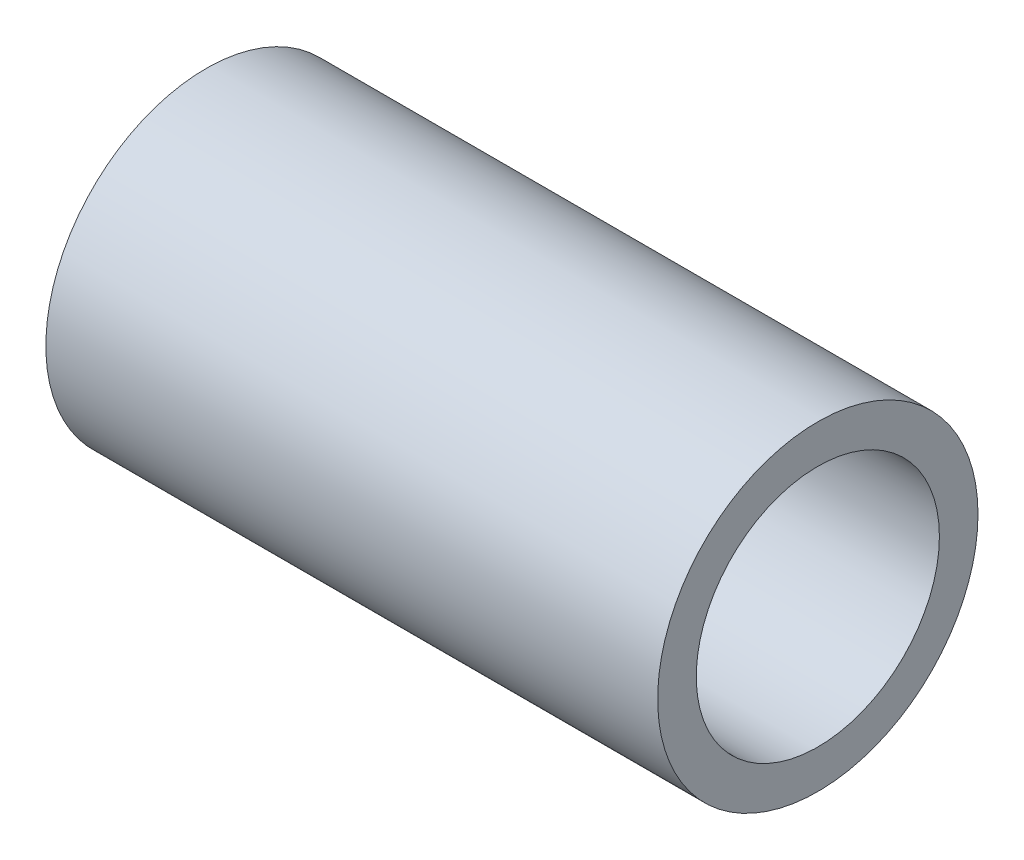
ISO-10303-21;
HEADER;
FILE_DESCRIPTION(('STEP AP214'),'2;1');
FILE_NAME('part.step','',(''),(''),'','','');
FILE_SCHEMA(('AUTOMOTIVE_DESIGN { 1 0 10303 214 1 1 1 1 }'));
ENDSEC;
DATA;
#1=APPLICATION_CONTEXT('core data for automotive mechanical design processes');
#2=APPLICATION_PROTOCOL_DEFINITION('international standard','automotive_design',2000,#1);
#3=PRODUCT_CONTEXT('',#1,'mechanical');
#4=PRODUCT('Part','Part','',(#3));
#5=PRODUCT_RELATED_PRODUCT_CATEGORY('part','',(#4));
#6=PRODUCT_DEFINITION_FORMATION('','',#4);
#7=PRODUCT_DEFINITION_CONTEXT('part definition',#1,'design');
#8=PRODUCT_DEFINITION('design','',#6,#7);
#9=PRODUCT_DEFINITION_SHAPE('','',#8);
#10=(LENGTH_UNIT() NAMED_UNIT(*) SI_UNIT(.MILLI.,.METRE.));
#11=(NAMED_UNIT(*) PLANE_ANGLE_UNIT() SI_UNIT($,.RADIAN.));
#12=(NAMED_UNIT(*) SI_UNIT($,.STERADIAN.) SOLID_ANGLE_UNIT());
#13=UNCERTAINTY_MEASURE_WITH_UNIT(LENGTH_MEASURE(1.E-05),#10,'distance_accuracy_value','');
#14=(GEOMETRIC_REPRESENTATION_CONTEXT(3) GLOBAL_UNCERTAINTY_ASSIGNED_CONTEXT((#13)) GLOBAL_UNIT_ASSIGNED_CONTEXT((#10,
#11,#12)) REPRESENTATION_CONTEXT('',''));
#15=CARTESIAN_POINT('',(0.,0.,0.));
#16=DIRECTION('',(0.,0.,1.));
#17=DIRECTION('',(1.,0.,0.));
#18=AXIS2_PLACEMENT_3D('',#15,#16,#17);
#19=CARTESIAN_POINT('',(50.325,0.,0.));
#20=DIRECTION('',(1.,0.,0.));
#21=DIRECTION('',(0.,0.,-1.));
#22=AXIS2_PLACEMENT_3D('',#19,#20,#21);
#23=PLANE('',#22);
#24=CARTESIAN_POINT('',(50.325,0.,0.));
#25=DIRECTION('',(1.,0.,0.));
#26=DIRECTION('',(0.,0.,-1.));
#27=AXIS2_PLACEMENT_3D('',#24,#25,#26);
#28=CIRCLE('',#27,13.175);
#29=CARTESIAN_POINT('',(50.325,0.,-13.175));
#30=VERTEX_POINT('',#29);
#31=EDGE_CURVE('E10',#30,#30,#28,.T.);
#32=ORIENTED_EDGE('',*,*,#31,.T.);
#33=EDGE_LOOP('',(#32));
#34=FACE_BOUND('',#33,.T.);
#35=CARTESIAN_POINT('',(50.325,0.,0.));
#36=DIRECTION('',(1.,0.,0.));
#37=DIRECTION('',(0.,0.,-1.));
#38=AXIS2_PLACEMENT_3D('',#35,#36,#37);
#39=CIRCLE('',#38,10.);
#40=CARTESIAN_POINT('',(50.325,0.,-10.));
#41=VERTEX_POINT('',#40);
#42=EDGE_CURVE('E40',#41,#41,#39,.T.);
#43=ORIENTED_EDGE('',*,*,#42,.F.);
#44=EDGE_LOOP('',(#43));
#45=FACE_BOUND('',#44,.T.);
#46=ADVANCED_FACE('F29',(#34,#45),#23,.T.);
#47=CARTESIAN_POINT('',(0.,0.,0.));
#48=DIRECTION('',(1.,0.,0.));
#49=DIRECTION('',(0.,0.,-1.));
#50=AXIS2_PLACEMENT_3D('',#47,#48,#49);
#51=PLANE('',#50);
#52=CARTESIAN_POINT('',(0.,0.,0.));
#53=DIRECTION('',(1.,0.,0.));
#54=DIRECTION('',(0.,0.,-1.));
#55=AXIS2_PLACEMENT_3D('',#52,#53,#54);
#56=CIRCLE('',#55,13.175);
#57=CARTESIAN_POINT('',(0.,0.,-13.175));
#58=VERTEX_POINT('',#57);
#59=EDGE_CURVE('E33',#58,#58,#56,.T.);
#60=ORIENTED_EDGE('',*,*,#59,.F.);
#61=EDGE_LOOP('',(#60));
#62=FACE_BOUND('',#61,.T.);
#63=CARTESIAN_POINT('',(0.,0.,0.));
#64=DIRECTION('',(1.,0.,0.));
#65=DIRECTION('',(0.,0.,-1.));
#66=AXIS2_PLACEMENT_3D('',#63,#64,#65);
#67=CIRCLE('',#66,10.);
#68=CARTESIAN_POINT('',(0.,0.,-10.));
#69=VERTEX_POINT('',#68);
#70=EDGE_CURVE('E42',#69,#69,#67,.T.);
#71=ORIENTED_EDGE('',*,*,#70,.T.);
#72=EDGE_LOOP('',(#71));
#73=FACE_BOUND('',#72,.T.);
#74=ADVANCED_FACE('F52',(#62,#73),#51,.F.);
#75=CARTESIAN_POINT('',(50.325,0.,0.));
#76=DIRECTION('',(-1.,0.,0.));
#77=DIRECTION('',(0.,0.,1.));
#78=AXIS2_PLACEMENT_3D('',#75,#76,#77);
#79=CYLINDRICAL_SURFACE('',#78,13.175);
#80=ORIENTED_EDGE('',*,*,#31,.F.);
#81=EDGE_LOOP('',(#80));
#82=FACE_BOUND('',#81,.T.);
#83=ORIENTED_EDGE('',*,*,#59,.T.);
#84=EDGE_LOOP('',(#83));
#85=FACE_BOUND('',#84,.T.);
#86=ADVANCED_FACE('F31',(#82,#85),#79,.T.);
#87=CARTESIAN_POINT('',(50.325,0.,0.));
#88=DIRECTION('',(-1.,0.,0.));
#89=DIRECTION('',(0.,0.,1.));
#90=AXIS2_PLACEMENT_3D('',#87,#88,#89);
#91=CYLINDRICAL_SURFACE('',#90,10.);
#92=ORIENTED_EDGE('',*,*,#42,.T.);
#93=EDGE_LOOP('',(#92));
#94=FACE_BOUND('',#93,.T.);
#95=ORIENTED_EDGE('',*,*,#70,.F.);
#96=EDGE_LOOP('',(#95));
#97=FACE_BOUND('',#96,.T.);
#98=ADVANCED_FACE('F48',(#94,#97),#91,.F.);
#99=CLOSED_SHELL('',(#46,#74,#86,#98));
#100=MANIFOLD_SOLID_BREP('B2',#99);
#101=ADVANCED_BREP_SHAPE_REPRESENTATION('',(#18,#100),#14);
#102=SHAPE_DEFINITION_REPRESENTATION(#9,#101);
ENDSEC;
END-ISO-10303-21;
